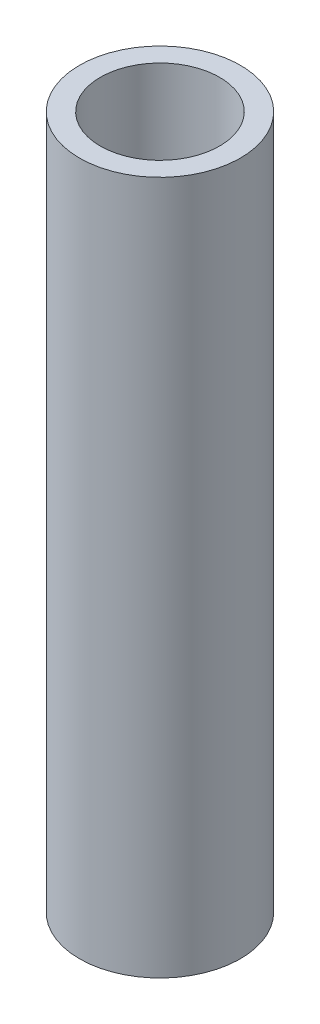
ISO-10303-21;
HEADER;
FILE_DESCRIPTION(('STEP AP214'),'2;1');
FILE_NAME('part.step','',(''),(''),'','','');
FILE_SCHEMA(('AUTOMOTIVE_DESIGN { 1 0 10303 214 1 1 1 1 }'));
ENDSEC;
DATA;
#1=APPLICATION_CONTEXT('core data for automotive mechanical design processes');
#2=APPLICATION_PROTOCOL_DEFINITION('international standard','automotive_design',2000,#1);
#3=PRODUCT_CONTEXT('',#1,'mechanical');
#4=PRODUCT('Part','Part','',(#3));
#5=PRODUCT_RELATED_PRODUCT_CATEGORY('part','',(#4));
#6=PRODUCT_DEFINITION_FORMATION('','',#4);
#7=PRODUCT_DEFINITION_CONTEXT('part definition',#1,'design');
#8=PRODUCT_DEFINITION('design','',#6,#7);
#9=PRODUCT_DEFINITION_SHAPE('','',#8);
#10=(LENGTH_UNIT() NAMED_UNIT(*) SI_UNIT(.MILLI.,.METRE.));
#11=(NAMED_UNIT(*) PLANE_ANGLE_UNIT() SI_UNIT($,.RADIAN.));
#12=(NAMED_UNIT(*) SI_UNIT($,.STERADIAN.) SOLID_ANGLE_UNIT());
#13=UNCERTAINTY_MEASURE_WITH_UNIT(LENGTH_MEASURE(1.E-05),#10,'distance_accuracy_value','');
#14=(GEOMETRIC_REPRESENTATION_CONTEXT(3) GLOBAL_UNCERTAINTY_ASSIGNED_CONTEXT((#13)) GLOBAL_UNIT_ASSIGNED_CONTEXT((#10,
#11,#12)) REPRESENTATION_CONTEXT('',''));
#15=CARTESIAN_POINT('',(0.,0.,0.));
#16=DIRECTION('',(0.,0.,1.));
#17=DIRECTION('',(1.,0.,0.));
#18=AXIS2_PLACEMENT_3D('',#15,#16,#17);
#19=CARTESIAN_POINT('',(0.,50.,0.));
#20=DIRECTION('',(0.,1.,0.));
#21=DIRECTION('',(0.,0.,1.));
#22=AXIS2_PLACEMENT_3D('',#19,#20,#21);
#23=PLANE('',#22);
#24=CARTESIAN_POINT('',(0.,50.,0.));
#25=DIRECTION('',(0.,1.,0.));
#26=DIRECTION('',(0.,0.,1.));
#27=AXIS2_PLACEMENT_3D('',#24,#25,#26);
#28=CIRCLE('',#27,5.8);
#29=CARTESIAN_POINT('',(0.,50.,5.8));
#30=VERTEX_POINT('',#29);
#31=EDGE_CURVE('E10',#30,#30,#28,.T.);
#32=ORIENTED_EDGE('',*,*,#31,.T.);
#33=EDGE_LOOP('',(#32));
#34=FACE_BOUND('',#33,.T.);
#35=CARTESIAN_POINT('',(0.,50.,0.));
#36=DIRECTION('',(0.,1.,0.));
#37=DIRECTION('',(0.,0.,1.));
#38=AXIS2_PLACEMENT_3D('',#35,#36,#37);
#39=CIRCLE('',#38,4.3);
#40=CARTESIAN_POINT('',(0.,50.,4.3));
#41=VERTEX_POINT('',#40);
#42=EDGE_CURVE('E44',#41,#41,#39,.T.);
#43=ORIENTED_EDGE('',*,*,#42,.F.);
#44=EDGE_LOOP('',(#43));
#45=FACE_BOUND('',#44,.T.);
#46=ADVANCED_FACE('F33',(#34,#45),#23,.T.);
#47=CARTESIAN_POINT('',(0.,0.,0.));
#48=DIRECTION('',(0.,1.,0.));
#49=DIRECTION('',(0.,0.,1.));
#50=AXIS2_PLACEMENT_3D('',#47,#48,#49);
#51=PLANE('',#50);
#52=CARTESIAN_POINT('',(0.,0.,0.));
#53=DIRECTION('',(0.,1.,0.));
#54=DIRECTION('',(0.,0.,1.));
#55=AXIS2_PLACEMENT_3D('',#52,#53,#54);
#56=CIRCLE('',#55,5.8);
#57=CARTESIAN_POINT('',(0.,0.,5.8));
#58=VERTEX_POINT('',#57);
#59=EDGE_CURVE('E37',#58,#58,#56,.T.);
#60=ORIENTED_EDGE('',*,*,#59,.F.);
#61=EDGE_LOOP('',(#60));
#62=FACE_BOUND('',#61,.T.);
#63=CARTESIAN_POINT('',(0.,0.,0.));
#64=DIRECTION('',(0.,1.,0.));
#65=DIRECTION('',(0.,0.,1.));
#66=AXIS2_PLACEMENT_3D('',#63,#64,#65);
#67=CIRCLE('',#66,4.3);
#68=CARTESIAN_POINT('',(0.,0.,4.3));
#69=VERTEX_POINT('',#68);
#70=EDGE_CURVE('E46',#69,#69,#67,.T.);
#71=ORIENTED_EDGE('',*,*,#70,.T.);
#72=EDGE_LOOP('',(#71));
#73=FACE_BOUND('',#72,.T.);
#74=ADVANCED_FACE('F56',(#62,#73),#51,.F.);
#75=CARTESIAN_POINT('',(0.,50.,0.));
#76=DIRECTION('',(0.,-1.,0.));
#77=DIRECTION('',(0.,0.,-1.));
#78=AXIS2_PLACEMENT_3D('',#75,#76,#77);
#79=CYLINDRICAL_SURFACE('',#78,5.8);
#80=ORIENTED_EDGE('',*,*,#31,.F.);
#81=EDGE_LOOP('',(#80));
#82=FACE_BOUND('',#81,.T.);
#83=ORIENTED_EDGE('',*,*,#59,.T.);
#84=EDGE_LOOP('',(#83));
#85=FACE_BOUND('',#84,.T.);
#86=ADVANCED_FACE('F35',(#82,#85),#79,.T.);
#87=CARTESIAN_POINT('',(0.,50.,0.));
#88=DIRECTION('',(0.,-1.,0.));
#89=DIRECTION('',(0.,0.,-1.));
#90=AXIS2_PLACEMENT_3D('',#87,#88,#89);
#91=CYLINDRICAL_SURFACE('',#90,4.3);
#92=ORIENTED_EDGE('',*,*,#42,.T.);
#93=EDGE_LOOP('',(#92));
#94=FACE_BOUND('',#93,.T.);
#95=ORIENTED_EDGE('',*,*,#70,.F.);
#96=EDGE_LOOP('',(#95));
#97=FACE_BOUND('',#96,.T.);
#98=ADVANCED_FACE('F52',(#94,#97),#91,.F.);
#99=CLOSED_SHELL('',(#46,#74,#86,#98));
#100=MANIFOLD_SOLID_BREP('B2',#99);
#101=ADVANCED_BREP_SHAPE_REPRESENTATION('',(#18,#100),#14);
#102=SHAPE_DEFINITION_REPRESENTATION(#9,#101);
ENDSEC;
END-ISO-10303-21;
